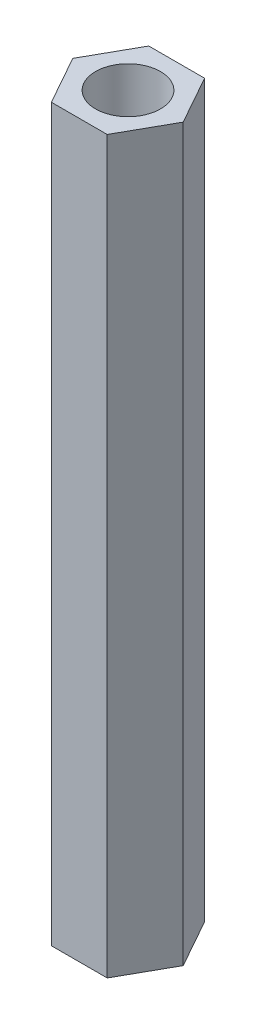
ISO-10303-21;
HEADER;
FILE_DESCRIPTION(('STEP AP214'),'2;1');
FILE_NAME('part.step','',(''),(''),'','','');
FILE_SCHEMA(('AUTOMOTIVE_DESIGN { 1 0 10303 214 1 1 1 1 }'));
ENDSEC;
DATA;
#1=APPLICATION_CONTEXT('core data for automotive mechanical design processes');
#2=APPLICATION_PROTOCOL_DEFINITION('international standard','automotive_design',2000,#1);
#3=PRODUCT_CONTEXT('',#1,'mechanical');
#4=PRODUCT('Part','Part','',(#3));
#5=PRODUCT_RELATED_PRODUCT_CATEGORY('part','',(#4));
#6=PRODUCT_DEFINITION_FORMATION('','',#4);
#7=PRODUCT_DEFINITION_CONTEXT('part definition',#1,'design');
#8=PRODUCT_DEFINITION('design','',#6,#7);
#9=PRODUCT_DEFINITION_SHAPE('','',#8);
#10=(LENGTH_UNIT() NAMED_UNIT(*) SI_UNIT(.MILLI.,.METRE.));
#11=(NAMED_UNIT(*) PLANE_ANGLE_UNIT() SI_UNIT($,.RADIAN.));
#12=(NAMED_UNIT(*) SI_UNIT($,.STERADIAN.) SOLID_ANGLE_UNIT());
#13=UNCERTAINTY_MEASURE_WITH_UNIT(LENGTH_MEASURE(1.E-05),#10,'distance_accuracy_value','');
#14=(GEOMETRIC_REPRESENTATION_CONTEXT(3) GLOBAL_UNCERTAINTY_ASSIGNED_CONTEXT((#13)) GLOBAL_UNIT_ASSIGNED_CONTEXT((#10,
#11,#12)) REPRESENTATION_CONTEXT('',''));
#15=CARTESIAN_POINT('',(0.,0.,0.));
#16=DIRECTION('',(0.,0.,1.));
#17=DIRECTION('',(1.,0.,0.));
#18=AXIS2_PLACEMENT_3D('',#15,#16,#17);
#19=CARTESIAN_POINT('',(0.,45.,0.));
#20=DIRECTION('',(0.,1.,0.));
#21=DIRECTION('',(0.,0.,1.));
#22=AXIS2_PLACEMENT_3D('',#19,#20,#21);
#23=PLANE('',#22);
#24=DIRECTION('',(1.,0.,0.));
#25=VECTOR('',#24,1.);
#26=CARTESIAN_POINT('',(-1.71934571937796,45.,3.));
#27=LINE('',#26,#25);
#28=CARTESIAN_POINT('',(-1.71934571937796,45.,3.));
#29=VERTEX_POINT('',#28);
#30=CARTESIAN_POINT('',(1.71934571937796,45.,3.));
#31=VERTEX_POINT('',#30);
#32=EDGE_CURVE('E152',#29,#31,#27,.T.);
#33=ORIENTED_EDGE('',*,*,#32,.T.);
#34=DIRECTION('',(0.488748208600563,0.,-0.872424889941673));
#35=VECTOR('',#34,1.);
#36=CARTESIAN_POINT('',(1.71934571937796,45.,3.));
#37=LINE('',#36,#35);
#38=CARTESIAN_POINT('',(3.4,45.,0.));
#39=VERTEX_POINT('',#38);
#40=EDGE_CURVE('E100',#31,#39,#37,.T.);
#41=ORIENTED_EDGE('',*,*,#40,.T.);
#42=DIRECTION('',(-0.488748208600563,0.,-0.872424889941673));
#43=VECTOR('',#42,1.);
#44=CARTESIAN_POINT('',(3.4,45.,0.));
#45=LINE('',#44,#43);
#46=CARTESIAN_POINT('',(1.71934571937796,45.,-3.));
#47=VERTEX_POINT('',#46);
#48=EDGE_CURVE('E113',#39,#47,#45,.T.);
#49=ORIENTED_EDGE('',*,*,#48,.T.);
#50=DIRECTION('',(-1.,0.,0.));
#51=VECTOR('',#50,1.);
#52=CARTESIAN_POINT('',(1.71934571937796,45.,-3.));
#53=LINE('',#52,#51);
#54=CARTESIAN_POINT('',(-1.71934571937796,45.,-3.));
#55=VERTEX_POINT('',#54);
#56=EDGE_CURVE('E107',#47,#55,#53,.T.);
#57=ORIENTED_EDGE('',*,*,#56,.T.);
#58=DIRECTION('',(-0.488748208600563,0.,0.872424889941673));
#59=VECTOR('',#58,1.);
#60=CARTESIAN_POINT('',(-1.71934571937796,45.,-3.));
#61=LINE('',#60,#59);
#62=CARTESIAN_POINT('',(-3.4,45.,0.));
#63=VERTEX_POINT('',#62);
#64=EDGE_CURVE('E111',#55,#63,#61,.T.);
#65=ORIENTED_EDGE('',*,*,#64,.T.);
#66=DIRECTION('',(0.488748208600563,0.,0.872424889941673));
#67=VECTOR('',#66,1.);
#68=CARTESIAN_POINT('',(-3.4,45.,0.));
#69=LINE('',#68,#67);
#70=EDGE_CURVE('E63',#63,#29,#69,.T.);
#71=ORIENTED_EDGE('',*,*,#70,.T.);
#72=EDGE_LOOP('',(#33,#41,#49,#57,#65,#71));
#73=FACE_BOUND('',#72,.T.);
#74=CARTESIAN_POINT('',(0.,45.,0.));
#75=DIRECTION('',(0.,1.,0.));
#76=DIRECTION('',(0.,0.,1.));
#77=AXIS2_PLACEMENT_3D('',#74,#75,#76);
#78=CIRCLE('',#77,2.);
#79=CARTESIAN_POINT('',(0.,45.,-2.));
#80=VERTEX_POINT('',#79);
#81=EDGE_CURVE('E140',#80,#80,#78,.T.);
#82=ORIENTED_EDGE('',*,*,#81,.F.);
#83=EDGE_LOOP('',(#82));
#84=FACE_BOUND('',#83,.T.);
#85=ADVANCED_FACE('F45',(#73,#84),#23,.T.);
#86=CARTESIAN_POINT('',(0.,0.,0.));
#87=DIRECTION('',(0.,1.,0.));
#88=DIRECTION('',(0.,0.,1.));
#89=AXIS2_PLACEMENT_3D('',#86,#87,#88);
#90=PLANE('',#89);
#91=DIRECTION('',(1.,0.,0.));
#92=VECTOR('',#91,1.);
#93=CARTESIAN_POINT('',(-1.71934571937796,0.,3.));
#94=LINE('',#93,#92);
#95=CARTESIAN_POINT('',(-1.71934571937796,0.,3.));
#96=VERTEX_POINT('',#95);
#97=CARTESIAN_POINT('',(1.71934571937796,0.,3.));
#98=VERTEX_POINT('',#97);
#99=EDGE_CURVE('E135',#96,#98,#94,.T.);
#100=ORIENTED_EDGE('',*,*,#99,.F.);
#101=DIRECTION('',(0.488748208600563,0.,0.872424889941673));
#102=VECTOR('',#101,1.);
#103=CARTESIAN_POINT('',(-3.4,0.,0.));
#104=LINE('',#103,#102);
#105=CARTESIAN_POINT('',(-3.4,0.,0.));
#106=VERTEX_POINT('',#105);
#107=EDGE_CURVE('E92',#106,#96,#104,.T.);
#108=ORIENTED_EDGE('',*,*,#107,.F.);
#109=DIRECTION('',(-0.488748208600563,0.,0.872424889941673));
#110=VECTOR('',#109,1.);
#111=CARTESIAN_POINT('',(-1.71934571937796,0.,-3.));
#112=LINE('',#111,#110);
#113=CARTESIAN_POINT('',(-1.71934571937796,0.,-3.));
#114=VERTEX_POINT('',#113);
#115=EDGE_CURVE('E86',#114,#106,#112,.T.);
#116=ORIENTED_EDGE('',*,*,#115,.F.);
#117=DIRECTION('',(-1.,0.,0.));
#118=VECTOR('',#117,1.);
#119=CARTESIAN_POINT('',(1.71934571937796,0.,-3.));
#120=LINE('',#119,#118);
#121=CARTESIAN_POINT('',(1.71934571937796,0.,-3.));
#122=VERTEX_POINT('',#121);
#123=EDGE_CURVE('E122',#122,#114,#120,.T.);
#124=ORIENTED_EDGE('',*,*,#123,.F.);
#125=DIRECTION('',(-0.488748208600563,0.,-0.872424889941673));
#126=VECTOR('',#125,1.);
#127=CARTESIAN_POINT('',(3.4,0.,0.));
#128=LINE('',#127,#126);
#129=CARTESIAN_POINT('',(3.4,0.,0.));
#130=VERTEX_POINT('',#129);
#131=EDGE_CURVE('E143',#130,#122,#128,.T.);
#132=ORIENTED_EDGE('',*,*,#131,.F.);
#133=DIRECTION('',(0.488748208600563,0.,-0.872424889941673));
#134=VECTOR('',#133,1.);
#135=CARTESIAN_POINT('',(1.71934571937796,0.,3.));
#136=LINE('',#135,#134);
#137=EDGE_CURVE('E139',#98,#130,#136,.T.);
#138=ORIENTED_EDGE('',*,*,#137,.F.);
#139=EDGE_LOOP('',(#100,#108,#116,#124,#132,#138));
#140=FACE_BOUND('',#139,.T.);
#141=CARTESIAN_POINT('',(0.,0.,0.));
#142=DIRECTION('',(0.,1.,0.));
#143=DIRECTION('',(0.,0.,1.));
#144=AXIS2_PLACEMENT_3D('',#141,#142,#143);
#145=CIRCLE('',#144,2.);
#146=CARTESIAN_POINT('',(0.,0.,-2.));
#147=VERTEX_POINT('',#146);
#148=EDGE_CURVE('E249',#147,#147,#145,.T.);
#149=ORIENTED_EDGE('',*,*,#148,.T.);
#150=EDGE_LOOP('',(#149));
#151=FACE_BOUND('',#150,.T.);
#152=ADVANCED_FACE('F165',(#140,#151),#90,.F.);
#153=CARTESIAN_POINT('',(-1.71934571937796,45.,3.));
#154=DIRECTION('',(0.,0.,-1.));
#155=DIRECTION('',(-1.,0.,0.));
#156=AXIS2_PLACEMENT_3D('',#153,#154,#155);
#157=PLANE('',#156);
#158=ORIENTED_EDGE('',*,*,#99,.T.);
#159=DIRECTION('',(0.,-1.,0.));
#160=VECTOR('',#159,1.);
#161=CARTESIAN_POINT('',(1.71934571937796,45.,3.));
#162=LINE('',#161,#160);
#163=EDGE_CURVE('E11',#31,#98,#162,.T.);
#164=ORIENTED_EDGE('',*,*,#163,.F.);
#165=ORIENTED_EDGE('',*,*,#32,.F.);
#166=DIRECTION('',(0.,-1.,0.));
#167=VECTOR('',#166,1.);
#168=CARTESIAN_POINT('',(-1.71934571937796,45.,3.));
#169=LINE('',#168,#167);
#170=EDGE_CURVE('E131',#29,#96,#169,.T.);
#171=ORIENTED_EDGE('',*,*,#170,.T.);
#172=EDGE_LOOP('',(#158,#164,#165,#171));
#173=FACE_BOUND('',#172,.T.);
#174=ADVANCED_FACE('F47',(#173),#157,.F.);
#175=CARTESIAN_POINT('',(1.71934571937796,45.,3.));
#176=DIRECTION('',(-0.872424889941673,0.,-0.488748208600563));
#177=DIRECTION('',(-0.488748208600563,0.,0.872424889941673));
#178=AXIS2_PLACEMENT_3D('',#175,#176,#177);
#179=PLANE('',#178);
#180=ORIENTED_EDGE('',*,*,#137,.T.);
#181=DIRECTION('',(0.,-1.,0.));
#182=VECTOR('',#181,1.);
#183=CARTESIAN_POINT('',(3.4,45.,0.));
#184=LINE('',#183,#182);
#185=EDGE_CURVE('E55',#39,#130,#184,.T.);
#186=ORIENTED_EDGE('',*,*,#185,.F.);
#187=ORIENTED_EDGE('',*,*,#40,.F.);
#188=ORIENTED_EDGE('',*,*,#163,.T.);
#189=EDGE_LOOP('',(#180,#186,#187,#188));
#190=FACE_BOUND('',#189,.T.);
#191=ADVANCED_FACE('F190',(#190),#179,.F.);
#192=CARTESIAN_POINT('',(3.4,45.,0.));
#193=DIRECTION('',(-0.872424889941673,0.,0.488748208600563));
#194=DIRECTION('',(0.488748208600563,0.,0.872424889941673));
#195=AXIS2_PLACEMENT_3D('',#192,#193,#194);
#196=PLANE('',#195);
#197=ORIENTED_EDGE('',*,*,#131,.T.);
#198=DIRECTION('',(0.,-1.,0.));
#199=VECTOR('',#198,1.);
#200=CARTESIAN_POINT('',(1.71934571937796,45.,-3.));
#201=LINE('',#200,#199);
#202=EDGE_CURVE('E124',#47,#122,#201,.T.);
#203=ORIENTED_EDGE('',*,*,#202,.F.);
#204=ORIENTED_EDGE('',*,*,#48,.F.);
#205=ORIENTED_EDGE('',*,*,#185,.T.);
#206=EDGE_LOOP('',(#197,#203,#204,#205));
#207=FACE_BOUND('',#206,.T.);
#208=ADVANCED_FACE('F162',(#207),#196,.F.);
#209=CARTESIAN_POINT('',(1.71934571937796,45.,-3.));
#210=DIRECTION('',(0.,0.,1.));
#211=DIRECTION('',(1.,0.,0.));
#212=AXIS2_PLACEMENT_3D('',#209,#210,#211);
#213=PLANE('',#212);
#214=ORIENTED_EDGE('',*,*,#123,.T.);
#215=DIRECTION('',(0.,-1.,0.));
#216=VECTOR('',#215,1.);
#217=CARTESIAN_POINT('',(-1.71934571937796,45.,-3.));
#218=LINE('',#217,#216);
#219=EDGE_CURVE('E119',#55,#114,#218,.T.);
#220=ORIENTED_EDGE('',*,*,#219,.F.);
#221=ORIENTED_EDGE('',*,*,#56,.F.);
#222=ORIENTED_EDGE('',*,*,#202,.T.);
#223=EDGE_LOOP('',(#214,#220,#221,#222));
#224=FACE_BOUND('',#223,.T.);
#225=ADVANCED_FACE('F120',(#224),#213,.F.);
#226=CARTESIAN_POINT('',(-1.71934571937796,45.,-3.));
#227=DIRECTION('',(0.872424889941673,0.,0.488748208600563));
#228=DIRECTION('',(0.488748208600563,0.,-0.872424889941673));
#229=AXIS2_PLACEMENT_3D('',#226,#227,#228);
#230=PLANE('',#229);
#231=ORIENTED_EDGE('',*,*,#115,.T.);
#232=DIRECTION('',(0.,-1.,0.));
#233=VECTOR('',#232,1.);
#234=CARTESIAN_POINT('',(-3.4,45.,0.));
#235=LINE('',#234,#233);
#236=EDGE_CURVE('E125',#63,#106,#235,.T.);
#237=ORIENTED_EDGE('',*,*,#236,.F.);
#238=ORIENTED_EDGE('',*,*,#64,.F.);
#239=ORIENTED_EDGE('',*,*,#219,.T.);
#240=EDGE_LOOP('',(#231,#237,#238,#239));
#241=FACE_BOUND('',#240,.T.);
#242=ADVANCED_FACE('F127',(#241),#230,.F.);
#243=CARTESIAN_POINT('',(-3.4,45.,0.));
#244=DIRECTION('',(0.872424889941673,0.,-0.488748208600563));
#245=DIRECTION('',(-0.488748208600563,0.,-0.872424889941673));
#246=AXIS2_PLACEMENT_3D('',#243,#244,#245);
#247=PLANE('',#246);
#248=ORIENTED_EDGE('',*,*,#107,.T.);
#249=ORIENTED_EDGE('',*,*,#170,.F.);
#250=ORIENTED_EDGE('',*,*,#70,.F.);
#251=ORIENTED_EDGE('',*,*,#236,.T.);
#252=EDGE_LOOP('',(#248,#249,#250,#251));
#253=FACE_BOUND('',#252,.T.);
#254=ADVANCED_FACE('F170',(#253),#247,.F.);
#255=CARTESIAN_POINT('',(0.,45.,0.));
#256=DIRECTION('',(0.,-1.,0.));
#257=DIRECTION('',(0.,0.,-1.));
#258=AXIS2_PLACEMENT_3D('',#255,#256,#257);
#259=CYLINDRICAL_SURFACE('',#258,2.);
#260=CARTESIAN_POINT('',(0.,45.,-2.));
#261=CARTESIAN_POINT('',(0.,44.53125,-2.));
#262=CARTESIAN_POINT('',(0.,44.0625,-2.));
#263=CARTESIAN_POINT('',(0.,43.125,-2.));
#264=CARTESIAN_POINT('',(0.,42.65625,-2.));
#265=CARTESIAN_POINT('',(0.,41.71875,-2.));
#266=CARTESIAN_POINT('',(0.,41.25,-2.));
#267=CARTESIAN_POINT('',(0.,40.3125,-2.));
#268=CARTESIAN_POINT('',(0.,39.84375,-2.));
#269=CARTESIAN_POINT('',(0.,38.90625,-2.));
#270=CARTESIAN_POINT('',(0.,38.4375,-2.));
#271=CARTESIAN_POINT('',(0.,37.5,-2.));
#272=CARTESIAN_POINT('',(0.,37.03125,-2.));
#273=CARTESIAN_POINT('',(0.,36.09375,-2.));
#274=CARTESIAN_POINT('',(0.,35.625,-2.));
#275=CARTESIAN_POINT('',(0.,34.6875,-2.));
#276=CARTESIAN_POINT('',(0.,34.21875,-2.));
#277=CARTESIAN_POINT('',(0.,33.28125,-2.));
#278=CARTESIAN_POINT('',(0.,32.8125,-2.));
#279=CARTESIAN_POINT('',(0.,31.875,-2.));
#280=CARTESIAN_POINT('',(0.,31.40625,-2.));
#281=CARTESIAN_POINT('',(0.,30.46875,-2.));
#282=CARTESIAN_POINT('',(0.,30.,-2.));
#283=CARTESIAN_POINT('',(0.,29.0625,-2.));
#284=CARTESIAN_POINT('',(0.,28.59375,-2.));
#285=CARTESIAN_POINT('',(0.,27.65625,-2.));
#286=CARTESIAN_POINT('',(0.,27.1875,-2.));
#287=CARTESIAN_POINT('',(0.,26.25,-2.));
#288=CARTESIAN_POINT('',(0.,25.78125,-2.));
#289=CARTESIAN_POINT('',(0.,24.84375,-2.));
#290=CARTESIAN_POINT('',(0.,24.375,-2.));
#291=CARTESIAN_POINT('',(0.,23.4375,-2.));
#292=CARTESIAN_POINT('',(0.,22.96875,-2.));
#293=CARTESIAN_POINT('',(0.,22.03125,-2.));
#294=CARTESIAN_POINT('',(0.,21.5625,-2.));
#295=CARTESIAN_POINT('',(0.,20.625,-2.));
#296=CARTESIAN_POINT('',(0.,20.15625,-2.));
#297=CARTESIAN_POINT('',(0.,19.21875,-2.));
#298=CARTESIAN_POINT('',(0.,18.75,-2.));
#299=CARTESIAN_POINT('',(0.,17.8125,-2.));
#300=CARTESIAN_POINT('',(0.,17.34375,-2.));
#301=CARTESIAN_POINT('',(0.,16.40625,-2.));
#302=CARTESIAN_POINT('',(0.,15.9375,-2.));
#303=CARTESIAN_POINT('',(0.,15.,-2.));
#304=CARTESIAN_POINT('',(0.,14.53125,-2.));
#305=CARTESIAN_POINT('',(0.,13.59375,-2.));
#306=CARTESIAN_POINT('',(0.,13.125,-2.));
#307=CARTESIAN_POINT('',(0.,12.1875,-2.));
#308=CARTESIAN_POINT('',(0.,11.71875,-2.));
#309=CARTESIAN_POINT('',(0.,10.78125,-2.));
#310=CARTESIAN_POINT('',(0.,10.3125,-2.));
#311=CARTESIAN_POINT('',(0.,9.37499999999999,-2.));
#312=CARTESIAN_POINT('',(0.,8.90624999999999,-2.));
#313=CARTESIAN_POINT('',(0.,7.96874999999999,-2.));
#314=CARTESIAN_POINT('',(0.,7.5,-2.));
#315=CARTESIAN_POINT('',(0.,6.56249999999999,-2.));
#316=CARTESIAN_POINT('',(0.,6.09374999999999,-2.));
#317=CARTESIAN_POINT('',(0.,5.15624999999999,-2.));
#318=CARTESIAN_POINT('',(0.,4.68749999999999,-2.));
#319=CARTESIAN_POINT('',(0.,3.74999999999999,-2.));
#320=CARTESIAN_POINT('',(0.,3.28124999999999,-2.));
#321=CARTESIAN_POINT('',(0.,2.34374999999999,-2.));
#322=CARTESIAN_POINT('',(0.,1.87499999999999,-2.));
#323=CARTESIAN_POINT('',(0.,0.937499999999992,-2.));
#324=CARTESIAN_POINT('',(0.,0.468749999999993,-2.));
#325=CARTESIAN_POINT('',(0.,0.,-2.));
#326=B_SPLINE_CURVE_WITH_KNOTS('',3,(#260,#261,#262,#263,#264,#265,#266,#267,#268,#269,#270,
#271,#272,#273,#274,#275,#276,#277,#278,#279,#280,#281,#282,#283,#284,#285,#286,#287,#288,#289,
#290,#291,#292,#293,#294,#295,#296,#297,#298,#299,#300,#301,#302,#303,#304,#305,#306,#307,#308,
#309,#310,#311,#312,#313,#314,#315,#316,#317,#318,#319,#320,#321,#322,#323,#324,#325),
.UNSPECIFIED.,.F.,.F.,(4,2,2,2,2,2,2,2,2,2,2,2,2,2,2,2,2,2,2,2,2,2,2,2,2,2,2,2,2,2,2,2,4),(0.,
1.40625,2.8125,4.21874999999999,5.625,7.03125,8.43749999999999,9.84375,11.25,12.65625,14.0625,
15.46875,16.875,18.28125,19.6875,21.09375,22.5,23.90625,25.3125,26.71875,28.125,29.53125,
30.9375,32.34375,33.75,35.15625,36.5625,37.96875,39.375,40.78125,42.1875,43.59375,45.),.UNSPECIFIED.);
#327=EDGE_CURVE('BSEAM172',#80,#147,#326,.T.);
#328=ORIENTED_EDGE('',*,*,#81,.T.);
#329=ORIENTED_EDGE('',*,*,#148,.F.);
#330=ORIENTED_EDGE('',*,*,#327,.T.);
#331=ORIENTED_EDGE('',*,*,#327,.F.);
#332=EDGE_LOOP('',(#328,#330,#329,#331));
#333=FACE_BOUND('',#332,.T.);
#334=ADVANCED_FACE('F172',(#333),#259,.F.);
#335=CLOSED_SHELL('',(#85,#152,#174,#191,#208,#225,#242,#254,#334));
#336=MANIFOLD_SOLID_BREP('B2',#335);
#337=ADVANCED_BREP_SHAPE_REPRESENTATION('',(#18,#336),#14);
#338=SHAPE_DEFINITION_REPRESENTATION(#9,#337);
ENDSEC;
END-ISO-10303-21;
